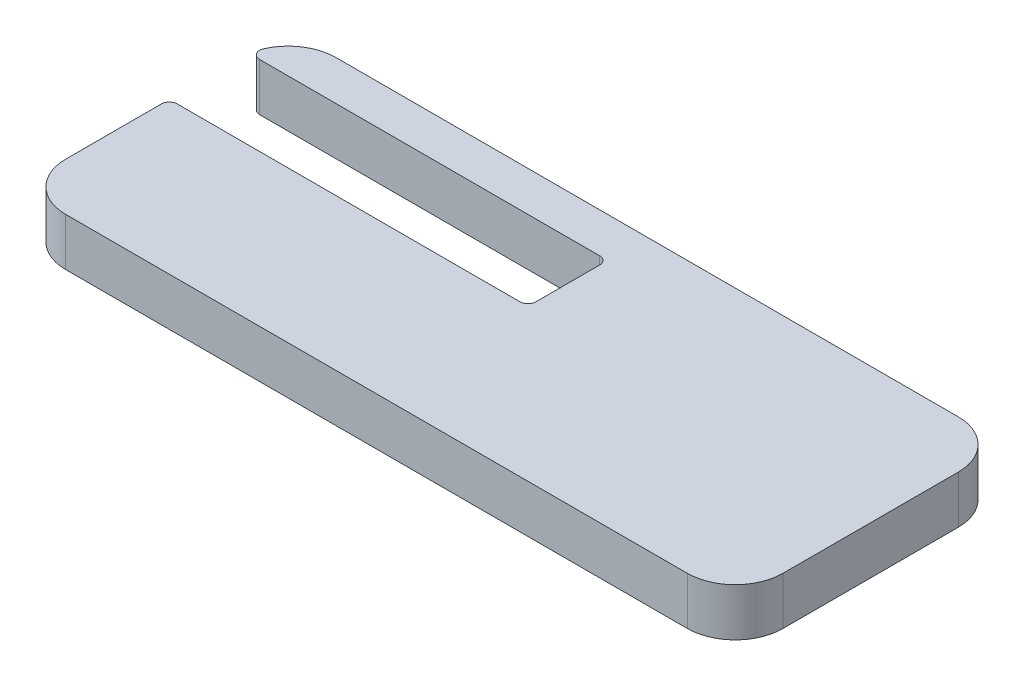
ISO-10303-21;
HEADER;
FILE_DESCRIPTION(('STEP AP214'),'2;1');
FILE_NAME('part.step','',(''),(''),'','','');
FILE_SCHEMA(('AUTOMOTIVE_DESIGN { 1 0 10303 214 1 1 1 1 }'));
ENDSEC;
DATA;
#1=APPLICATION_CONTEXT('core data for automotive mechanical design processes');
#2=APPLICATION_PROTOCOL_DEFINITION('international standard','automotive_design',2000,#1);
#3=PRODUCT_CONTEXT('',#1,'mechanical');
#4=PRODUCT('Part','Part','',(#3));
#5=PRODUCT_RELATED_PRODUCT_CATEGORY('part','',(#4));
#6=PRODUCT_DEFINITION_FORMATION('','',#4);
#7=PRODUCT_DEFINITION_CONTEXT('part definition',#1,'design');
#8=PRODUCT_DEFINITION('design','',#6,#7);
#9=PRODUCT_DEFINITION_SHAPE('','',#8);
#10=(LENGTH_UNIT() NAMED_UNIT(*) SI_UNIT(.MILLI.,.METRE.));
#11=(NAMED_UNIT(*) PLANE_ANGLE_UNIT() SI_UNIT($,.RADIAN.));
#12=(NAMED_UNIT(*) SI_UNIT($,.STERADIAN.) SOLID_ANGLE_UNIT());
#13=UNCERTAINTY_MEASURE_WITH_UNIT(LENGTH_MEASURE(1.E-05),#10,'distance_accuracy_value','');
#14=(GEOMETRIC_REPRESENTATION_CONTEXT(3) GLOBAL_UNCERTAINTY_ASSIGNED_CONTEXT((#13)) GLOBAL_UNIT_ASSIGNED_CONTEXT((#10,
#11,#12)) REPRESENTATION_CONTEXT('',''));
#15=CARTESIAN_POINT('',(0.,0.,0.));
#16=DIRECTION('',(0.,0.,1.));
#17=DIRECTION('',(1.,0.,0.));
#18=AXIS2_PLACEMENT_3D('',#15,#16,#17);
#19=CARTESIAN_POINT('',(-22.5,3.,-9.92984720943611));
#20=DIRECTION('',(1.,0.,0.));
#21=DIRECTION('',(0.,0.,-1.));
#22=AXIS2_PLACEMENT_3D('',#19,#20,#21);
#23=PLANE('',#22);
#24=DIRECTION('',(0.,0.,1.));
#25=VECTOR('',#24,1.);
#26=CARTESIAN_POINT('',(-22.5,3.,-9.92984720943611));
#27=LINE('',#26,#25);
#28=CARTESIAN_POINT('',(-22.5,3.,-1.92984720943611));
#29=VERTEX_POINT('',#28);
#30=CARTESIAN_POINT('',(-22.5,3.,4.07015279056389));
#31=VERTEX_POINT('',#30);
#32=EDGE_CURVE('E196',#29,#31,#27,.T.);
#33=ORIENTED_EDGE('',*,*,#32,.F.);
#34=DIRECTION('',(0.,1.,0.));
#35=VECTOR('',#34,1.);
#36=CARTESIAN_POINT('',(-22.5,3.,-1.92984720943611));
#37=LINE('',#36,#35);
#38=CARTESIAN_POINT('',(-22.5,0.,-1.92984720943611));
#39=VERTEX_POINT('',#38);
#40=EDGE_CURVE('E265',#29,#39,#37,.F.);
#41=ORIENTED_EDGE('',*,*,#40,.T.);
#42=DIRECTION('',(0.,0.,1.));
#43=VECTOR('',#42,1.);
#44=CARTESIAN_POINT('',(-22.5,0.,-9.92984720943611));
#45=LINE('',#44,#43);
#46=CARTESIAN_POINT('',(-22.5,0.,4.07015279056389));
#47=VERTEX_POINT('',#46);
#48=EDGE_CURVE('E182',#39,#47,#45,.T.);
#49=ORIENTED_EDGE('',*,*,#48,.T.);
#50=DIRECTION('',(0.,-1.,0.));
#51=VECTOR('',#50,1.);
#52=CARTESIAN_POINT('',(-22.5,3.,4.07015279056389));
#53=LINE('',#52,#51);
#54=EDGE_CURVE('E158',#47,#31,#53,.F.);
#55=ORIENTED_EDGE('',*,*,#54,.T.);
#56=EDGE_LOOP('',(#33,#41,#49,#55));
#57=FACE_BOUND('',#56,.T.);
#58=ADVANCED_FACE('F42',(#57),#23,.F.);
#59=CARTESIAN_POINT('',(-22.5,3.,7.07015279056389));
#60=DIRECTION('',(0.,0.,-1.));
#61=DIRECTION('',(-1.,0.,0.));
#62=AXIS2_PLACEMENT_3D('',#59,#60,#61);
#63=PLANE('',#62);
#64=DIRECTION('',(1.,0.,0.));
#65=VECTOR('',#64,1.);
#66=CARTESIAN_POINT('',(-22.5,3.,7.07015279056389));
#67=LINE('',#66,#65);
#68=CARTESIAN_POINT('',(-19.5,3.,7.07015279056389));
#69=VERTEX_POINT('',#68);
#70=CARTESIAN_POINT('',(19.5,3.,7.07015279056389));
#71=VERTEX_POINT('',#70);
#72=EDGE_CURVE('E171',#69,#71,#67,.T.);
#73=ORIENTED_EDGE('',*,*,#72,.F.);
#74=DIRECTION('',(0.,-1.,0.));
#75=VECTOR('',#74,1.);
#76=CARTESIAN_POINT('',(-19.5,3.,7.07015279056389));
#77=LINE('',#76,#75);
#78=CARTESIAN_POINT('',(-19.5,0.,7.07015279056389));
#79=VERTEX_POINT('',#78);
#80=EDGE_CURVE('E156',#69,#79,#77,.T.);
#81=ORIENTED_EDGE('',*,*,#80,.T.);
#82=DIRECTION('',(1.,0.,0.));
#83=VECTOR('',#82,1.);
#84=CARTESIAN_POINT('',(-22.5,0.,7.07015279056389));
#85=LINE('',#84,#83);
#86=CARTESIAN_POINT('',(19.5,0.,7.07015279056389));
#87=VERTEX_POINT('',#86);
#88=EDGE_CURVE('E168',#79,#87,#85,.T.);
#89=ORIENTED_EDGE('',*,*,#88,.T.);
#90=DIRECTION('',(0.,-1.,0.));
#91=VECTOR('',#90,1.);
#92=CARTESIAN_POINT('',(19.5,3.,7.07015279056389));
#93=LINE('',#92,#91);
#94=EDGE_CURVE('E174',#87,#71,#93,.F.);
#95=ORIENTED_EDGE('',*,*,#94,.T.);
#96=EDGE_LOOP('',(#73,#81,#89,#95));
#97=FACE_BOUND('',#96,.T.);
#98=ADVANCED_FACE('F167',(#97),#63,.F.);
#99=CARTESIAN_POINT('',(22.5,3.,-9.92984720943611));
#100=DIRECTION('',(-1.,0.,0.));
#101=DIRECTION('',(0.,0.,1.));
#102=AXIS2_PLACEMENT_3D('',#99,#100,#101);
#103=PLANE('',#102);
#104=DIRECTION('',(0.,0.,-1.));
#105=VECTOR('',#104,1.);
#106=CARTESIAN_POINT('',(22.5,3.,-9.92984720943611));
#107=LINE('',#106,#105);
#108=CARTESIAN_POINT('',(22.5,3.,4.07015279056389));
#109=VERTEX_POINT('',#108);
#110=CARTESIAN_POINT('',(22.5,3.,-6.92984720943611));
#111=VERTEX_POINT('',#110);
#112=EDGE_CURVE('E318',#109,#111,#107,.T.);
#113=ORIENTED_EDGE('',*,*,#112,.F.);
#114=DIRECTION('',(0.,-1.,0.));
#115=VECTOR('',#114,1.);
#116=CARTESIAN_POINT('',(22.5,3.,4.07015279056389));
#117=LINE('',#116,#115);
#118=CARTESIAN_POINT('',(22.5,0.,4.07015279056389));
#119=VERTEX_POINT('',#118);
#120=EDGE_CURVE('E231',#109,#119,#117,.T.);
#121=ORIENTED_EDGE('',*,*,#120,.T.);
#122=DIRECTION('',(0.,0.,-1.));
#123=VECTOR('',#122,1.);
#124=CARTESIAN_POINT('',(22.5,0.,-9.92984720943611));
#125=LINE('',#124,#123);
#126=CARTESIAN_POINT('',(22.5,0.,-6.92984720943611));
#127=VERTEX_POINT('',#126);
#128=EDGE_CURVE('E181',#119,#127,#125,.T.);
#129=ORIENTED_EDGE('',*,*,#128,.T.);
#130=DIRECTION('',(0.,-1.,0.));
#131=VECTOR('',#130,1.);
#132=CARTESIAN_POINT('',(22.5,3.,-6.92984720943611));
#133=LINE('',#132,#131);
#134=EDGE_CURVE('E228',#127,#111,#133,.F.);
#135=ORIENTED_EDGE('',*,*,#134,.T.);
#136=EDGE_LOOP('',(#113,#121,#129,#135));
#137=FACE_BOUND('',#136,.T.);
#138=ADVANCED_FACE('F342',(#137),#103,.F.);
#139=CARTESIAN_POINT('',(-22.5,3.,-9.92984720943611));
#140=DIRECTION('',(0.,0.,1.));
#141=DIRECTION('',(1.,0.,0.));
#142=AXIS2_PLACEMENT_3D('',#139,#140,#141);
#143=PLANE('',#142);
#144=DIRECTION('',(-1.,0.,0.));
#145=VECTOR('',#144,1.);
#146=CARTESIAN_POINT('',(-22.5,0.,-9.92984720943611));
#147=LINE('',#146,#145);
#148=CARTESIAN_POINT('',(19.5,0.,-9.92984720943611));
#149=VERTEX_POINT('',#148);
#150=CARTESIAN_POINT('',(-19.5419601084502,0.,-9.92984720943611));
#151=VERTEX_POINT('',#150);
#152=EDGE_CURVE('E187',#149,#151,#147,.T.);
#153=ORIENTED_EDGE('',*,*,#152,.T.);
#154=DIRECTION('',(0.,1.,0.));
#155=VECTOR('',#154,1.);
#156=CARTESIAN_POINT('',(-19.5419601084502,3.,-9.92984720943611));
#157=LINE('',#156,#155);
#158=CARTESIAN_POINT('',(-19.5419601084502,3.,-9.92984720943611));
#159=VERTEX_POINT('',#158);
#160=EDGE_CURVE('E225',#151,#159,#157,.T.);
#161=ORIENTED_EDGE('',*,*,#160,.T.);
#162=DIRECTION('',(-1.,0.,0.));
#163=VECTOR('',#162,1.);
#164=CARTESIAN_POINT('',(-22.5,3.,-9.92984720943611));
#165=LINE('',#164,#163);
#166=CARTESIAN_POINT('',(19.5,3.,-9.92984720943611));
#167=VERTEX_POINT('',#166);
#168=EDGE_CURVE('E198',#167,#159,#165,.T.);
#169=ORIENTED_EDGE('',*,*,#168,.F.);
#170=DIRECTION('',(0.,-1.,0.));
#171=VECTOR('',#170,1.);
#172=CARTESIAN_POINT('',(19.5,3.,-9.92984720943611));
#173=LINE('',#172,#171);
#174=EDGE_CURVE('E221',#167,#149,#173,.T.);
#175=ORIENTED_EDGE('',*,*,#174,.T.);
#176=EDGE_LOOP('',(#153,#161,#169,#175));
#177=FACE_BOUND('',#176,.T.);
#178=ADVANCED_FACE('F336',(#177),#143,.F.);
#179=CARTESIAN_POINT('',(0.,3.,0.));
#180=DIRECTION('',(0.,1.,0.));
#181=DIRECTION('',(0.,0.,1.));
#182=AXIS2_PLACEMENT_3D('',#179,#180,#181);
#183=PLANE('',#182);
#184=CARTESIAN_POINT('',(-19.5419601084502,3.,-6.92984720943611));
#185=DIRECTION('',(0.,1.,0.));
#186=DIRECTION('',(0.,0.,1.));
#187=AXIS2_PLACEMENT_3D('',#184,#185,#186);
#188=CIRCLE('',#187,3.);
#189=CARTESIAN_POINT('',(-22.2915055254237,3.,-8.12984720943611));
#190=VERTEX_POINT('',#189);
#191=EDGE_CURVE('E214',#159,#190,#188,.T.);
#192=ORIENTED_EDGE('',*,*,#191,.T.);
#193=CARTESIAN_POINT('',(-21.8332479559281,3.,-7.92984720943611));
#194=DIRECTION('',(0.,1.,0.));
#195=DIRECTION('',(0.,0.,1.));
#196=AXIS2_PLACEMENT_3D('',#193,#194,#195);
#197=CIRCLE('',#196,0.5);
#198=CARTESIAN_POINT('',(-21.8332479559281,3.,-7.42984720943611));
#199=VERTEX_POINT('',#198);
#200=EDGE_CURVE('E242',#190,#199,#197,.T.);
#201=ORIENTED_EDGE('',*,*,#200,.T.);
#202=DIRECTION('',(-1.,0.,0.));
#203=VECTOR('',#202,1.);
#204=CARTESIAN_POINT('',(-22.5,3.,-7.42984720943611));
#205=LINE('',#204,#203);
#206=CARTESIAN_POINT('',(-0.500000000000007,3.,-7.42984720943611));
#207=VERTEX_POINT('',#206);
#208=EDGE_CURVE('E285',#207,#199,#205,.T.);
#209=ORIENTED_EDGE('',*,*,#208,.F.);
#210=CARTESIAN_POINT('',(-0.5,3.,-6.92984720943611));
#211=DIRECTION('',(0.,1.,0.));
#212=DIRECTION('',(0.,0.,1.));
#213=AXIS2_PLACEMENT_3D('',#210,#211,#212);
#214=CIRCLE('',#213,0.5);
#215=CARTESIAN_POINT('',(0.,3.,-6.92984720943611));
#216=VERTEX_POINT('',#215);
#217=EDGE_CURVE('E51',#207,#216,#214,.F.);
#218=ORIENTED_EDGE('',*,*,#217,.T.);
#219=DIRECTION('',(0.,0.,-1.));
#220=VECTOR('',#219,1.);
#221=CARTESIAN_POINT('',(0.,3.,-7.42984720943611));
#222=LINE('',#221,#220);
#223=CARTESIAN_POINT('',(0.,3.,-2.92984720943611));
#224=VERTEX_POINT('',#223);
#225=EDGE_CURVE('E283',#224,#216,#222,.T.);
#226=ORIENTED_EDGE('',*,*,#225,.F.);
#227=CARTESIAN_POINT('',(-0.499999999999999,3.,-2.92984720943611));
#228=DIRECTION('',(0.,1.,0.));
#229=DIRECTION('',(0.,0.,1.));
#230=AXIS2_PLACEMENT_3D('',#227,#228,#229);
#231=CIRCLE('',#230,0.5);
#232=CARTESIAN_POINT('',(-0.500000000000007,3.,-2.42984720943611));
#233=VERTEX_POINT('',#232);
#234=EDGE_CURVE('E274',#224,#233,#231,.F.);
#235=ORIENTED_EDGE('',*,*,#234,.T.);
#236=DIRECTION('',(1.,0.,0.));
#237=VECTOR('',#236,1.);
#238=CARTESIAN_POINT('',(-22.5,3.,-2.42984720943611));
#239=LINE('',#238,#237);
#240=CARTESIAN_POINT('',(-22.,3.,-2.42984720943611));
#241=VERTEX_POINT('',#240);
#242=EDGE_CURVE('E291',#241,#233,#239,.T.);
#243=ORIENTED_EDGE('',*,*,#242,.F.);
#244=CARTESIAN_POINT('',(-22.,3.,-1.92984720943611));
#245=DIRECTION('',(0.,1.,0.));
#246=DIRECTION('',(0.,0.,1.));
#247=AXIS2_PLACEMENT_3D('',#244,#245,#246);
#248=CIRCLE('',#247,0.5);
#249=EDGE_CURVE('E239',#241,#29,#248,.T.);
#250=ORIENTED_EDGE('',*,*,#249,.T.);
#251=ORIENTED_EDGE('',*,*,#32,.T.);
#252=CARTESIAN_POINT('',(-19.5,3.,4.07015279056389));
#253=DIRECTION('',(0.,1.,0.));
#254=DIRECTION('',(0.,0.,1.));
#255=AXIS2_PLACEMENT_3D('',#252,#253,#254);
#256=CIRCLE('',#255,3.);
#257=EDGE_CURVE('E218',#31,#69,#256,.T.);
#258=ORIENTED_EDGE('',*,*,#257,.T.);
#259=ORIENTED_EDGE('',*,*,#72,.T.);
#260=CARTESIAN_POINT('',(19.5,3.,4.07015279056389));
#261=DIRECTION('',(0.,1.,0.));
#262=DIRECTION('',(0.,0.,1.));
#263=AXIS2_PLACEMENT_3D('',#260,#261,#262);
#264=CIRCLE('',#263,3.);
#265=EDGE_CURVE('E211',#71,#109,#264,.T.);
#266=ORIENTED_EDGE('',*,*,#265,.T.);
#267=ORIENTED_EDGE('',*,*,#112,.T.);
#268=CARTESIAN_POINT('',(19.5,3.,-6.92984720943611));
#269=DIRECTION('',(0.,1.,0.));
#270=DIRECTION('',(0.,0.,1.));
#271=AXIS2_PLACEMENT_3D('',#268,#269,#270);
#272=CIRCLE('',#271,3.);
#273=EDGE_CURVE('E208',#111,#167,#272,.T.);
#274=ORIENTED_EDGE('',*,*,#273,.T.);
#275=ORIENTED_EDGE('',*,*,#168,.T.);
#276=EDGE_LOOP('',(#192,#201,#209,#218,#226,#235,#243,#250,#251,#258,#259,#266,#267,#274,#275));
#277=FACE_BOUND('',#276,.T.);
#278=ADVANCED_FACE('F282',(#277),#183,.T.);
#279=CARTESIAN_POINT('',(0.,0.,0.));
#280=DIRECTION('',(0.,1.,0.));
#281=DIRECTION('',(0.,0.,1.));
#282=AXIS2_PLACEMENT_3D('',#279,#280,#281);
#283=PLANE('',#282);
#284=DIRECTION('',(1.,0.,0.));
#285=VECTOR('',#284,1.);
#286=CARTESIAN_POINT('',(-22.5,0.,-7.42984720943611));
#287=LINE('',#286,#285);
#288=CARTESIAN_POINT('',(-21.8332479559281,0.,-7.42984720943611));
#289=VERTEX_POINT('',#288);
#290=CARTESIAN_POINT('',(-0.5,0.,-7.42984720943611));
#291=VERTEX_POINT('',#290);
#292=EDGE_CURVE('E295',#289,#291,#287,.T.);
#293=ORIENTED_EDGE('',*,*,#292,.F.);
#294=CARTESIAN_POINT('',(-21.8332479559281,0.,-7.92984720943611));
#295=DIRECTION('',(0.,1.,0.));
#296=DIRECTION('',(0.,0.,1.));
#297=AXIS2_PLACEMENT_3D('',#294,#295,#296);
#298=CIRCLE('',#297,0.5);
#299=CARTESIAN_POINT('',(-22.2915055254237,0.,-8.12984720943611));
#300=VERTEX_POINT('',#299);
#301=EDGE_CURVE('E255',#289,#300,#298,.F.);
#302=ORIENTED_EDGE('',*,*,#301,.T.);
#303=CARTESIAN_POINT('',(-19.5419601084502,0.,-6.92984720943611));
#304=DIRECTION('',(0.,1.,0.));
#305=DIRECTION('',(0.,0.,1.));
#306=AXIS2_PLACEMENT_3D('',#303,#304,#305);
#307=CIRCLE('',#306,3.);
#308=EDGE_CURVE('E162',#300,#151,#307,.F.);
#309=ORIENTED_EDGE('',*,*,#308,.T.);
#310=ORIENTED_EDGE('',*,*,#152,.F.);
#311=CARTESIAN_POINT('',(19.5,0.,-6.92984720943611));
#312=DIRECTION('',(0.,1.,0.));
#313=DIRECTION('',(0.,0.,1.));
#314=AXIS2_PLACEMENT_3D('',#311,#312,#313);
#315=CIRCLE('',#314,3.);
#316=EDGE_CURVE('E173',#149,#127,#315,.F.);
#317=ORIENTED_EDGE('',*,*,#316,.T.);
#318=ORIENTED_EDGE('',*,*,#128,.F.);
#319=CARTESIAN_POINT('',(19.5,0.,4.07015279056389));
#320=DIRECTION('',(0.,1.,0.));
#321=DIRECTION('',(0.,0.,1.));
#322=AXIS2_PLACEMENT_3D('',#319,#320,#321);
#323=CIRCLE('',#322,3.);
#324=EDGE_CURVE('E179',#119,#87,#323,.F.);
#325=ORIENTED_EDGE('',*,*,#324,.T.);
#326=ORIENTED_EDGE('',*,*,#88,.F.);
#327=CARTESIAN_POINT('',(-19.5,0.,4.07015279056389));
#328=DIRECTION('',(0.,1.,0.));
#329=DIRECTION('',(0.,0.,1.));
#330=AXIS2_PLACEMENT_3D('',#327,#328,#329);
#331=CIRCLE('',#330,3.);
#332=EDGE_CURVE('E152',#79,#47,#331,.F.);
#333=ORIENTED_EDGE('',*,*,#332,.T.);
#334=ORIENTED_EDGE('',*,*,#48,.F.);
#335=CARTESIAN_POINT('',(-22.,0.,-1.92984720943611));
#336=DIRECTION('',(0.,1.,0.));
#337=DIRECTION('',(0.,0.,1.));
#338=AXIS2_PLACEMENT_3D('',#335,#336,#337);
#339=CIRCLE('',#338,0.5);
#340=CARTESIAN_POINT('',(-22.,0.,-2.42984720943611));
#341=VERTEX_POINT('',#340);
#342=EDGE_CURVE('E252',#39,#341,#339,.F.);
#343=ORIENTED_EDGE('',*,*,#342,.T.);
#344=DIRECTION('',(-1.,0.,0.));
#345=VECTOR('',#344,1.);
#346=CARTESIAN_POINT('',(-22.5,0.,-2.42984720943611));
#347=LINE('',#346,#345);
#348=CARTESIAN_POINT('',(-0.5,0.,-2.42984720943611));
#349=VERTEX_POINT('',#348);
#350=EDGE_CURVE('E189',#349,#341,#347,.T.);
#351=ORIENTED_EDGE('',*,*,#350,.F.);
#352=CARTESIAN_POINT('',(-0.499999999999999,0.,-2.92984720943611));
#353=DIRECTION('',(0.,1.,0.));
#354=DIRECTION('',(0.,0.,1.));
#355=AXIS2_PLACEMENT_3D('',#352,#353,#354);
#356=CIRCLE('',#355,0.5);
#357=CARTESIAN_POINT('',(0.,0.,-2.92984720943611));
#358=VERTEX_POINT('',#357);
#359=EDGE_CURVE('E58',#349,#358,#356,.T.);
#360=ORIENTED_EDGE('',*,*,#359,.T.);
#361=DIRECTION('',(0.,0.,1.));
#362=VECTOR('',#361,1.);
#363=CARTESIAN_POINT('',(0.,0.,-7.42984720943611));
#364=LINE('',#363,#362);
#365=CARTESIAN_POINT('',(0.,0.,-6.92984720943611));
#366=VERTEX_POINT('',#365);
#367=EDGE_CURVE('E297',#366,#358,#364,.T.);
#368=ORIENTED_EDGE('',*,*,#367,.F.);
#369=CARTESIAN_POINT('',(-0.5,0.,-6.92984720943611));
#370=DIRECTION('',(0.,1.,0.));
#371=DIRECTION('',(0.,0.,1.));
#372=AXIS2_PLACEMENT_3D('',#369,#370,#371);
#373=CIRCLE('',#372,0.5);
#374=EDGE_CURVE('E11',#366,#291,#373,.T.);
#375=ORIENTED_EDGE('',*,*,#374,.T.);
#376=EDGE_LOOP('',(#293,#302,#309,#310,#317,#318,#325,#326,#333,#334,#343,#351,#360,#368,#375));
#377=FACE_BOUND('',#376,.T.);
#378=ADVANCED_FACE('F177',(#377),#283,.F.);
#379=CARTESIAN_POINT('',(-22.5,-23.0488611432322,-7.42984720943611));
#380=DIRECTION('',(0.,0.,-1.));
#381=DIRECTION('',(-1.,0.,0.));
#382=AXIS2_PLACEMENT_3D('',#379,#380,#381);
#383=PLANE('',#382);
#384=ORIENTED_EDGE('',*,*,#208,.T.);
#385=DIRECTION('',(0.,-1.,0.));
#386=VECTOR('',#385,1.);
#387=CARTESIAN_POINT('',(-21.8332479559281,0.,-7.42984720943611));
#388=LINE('',#387,#386);
#389=EDGE_CURVE('E249',#199,#289,#388,.T.);
#390=ORIENTED_EDGE('',*,*,#389,.T.);
#391=ORIENTED_EDGE('',*,*,#292,.T.);
#392=DIRECTION('',(0.,1.,0.));
#393=VECTOR('',#392,1.);
#394=CARTESIAN_POINT('',(-0.5,3.,-7.42984720943611));
#395=LINE('',#394,#393);
#396=EDGE_CURVE('E245',#291,#207,#395,.T.);
#397=ORIENTED_EDGE('',*,*,#396,.T.);
#398=EDGE_LOOP('',(#384,#390,#391,#397));
#399=FACE_BOUND('',#398,.T.);
#400=ADVANCED_FACE('F299',(#399),#383,.F.);
#401=CARTESIAN_POINT('',(0.,-23.0488611432322,-7.42984720943611));
#402=DIRECTION('',(1.,0.,0.));
#403=DIRECTION('',(0.,0.,-1.));
#404=AXIS2_PLACEMENT_3D('',#401,#402,#403);
#405=PLANE('',#404);
#406=ORIENTED_EDGE('',*,*,#367,.T.);
#407=DIRECTION('',(0.,1.,0.));
#408=VECTOR('',#407,1.);
#409=CARTESIAN_POINT('',(0.,3.,-2.92984720943611));
#410=LINE('',#409,#408);
#411=EDGE_CURVE('E270',#358,#224,#410,.T.);
#412=ORIENTED_EDGE('',*,*,#411,.T.);
#413=ORIENTED_EDGE('',*,*,#225,.T.);
#414=DIRECTION('',(0.,1.,0.));
#415=VECTOR('',#414,1.);
#416=CARTESIAN_POINT('',(0.,0.,-6.92984720943611));
#417=LINE('',#416,#415);
#418=EDGE_CURVE('E65',#216,#366,#417,.F.);
#419=ORIENTED_EDGE('',*,*,#418,.T.);
#420=EDGE_LOOP('',(#406,#412,#413,#419));
#421=FACE_BOUND('',#420,.T.);
#422=ADVANCED_FACE('F288',(#421),#405,.F.);
#423=CARTESIAN_POINT('',(-22.5,-23.0488611432322,-2.42984720943611));
#424=DIRECTION('',(0.,0.,1.));
#425=DIRECTION('',(1.,0.,0.));
#426=AXIS2_PLACEMENT_3D('',#423,#424,#425);
#427=PLANE('',#426);
#428=ORIENTED_EDGE('',*,*,#350,.T.);
#429=DIRECTION('',(0.,1.,0.));
#430=VECTOR('',#429,1.);
#431=CARTESIAN_POINT('',(-22.,-23.0488611432322,-2.42984720943611));
#432=LINE('',#431,#430);
#433=EDGE_CURVE('E261',#341,#241,#432,.T.);
#434=ORIENTED_EDGE('',*,*,#433,.T.);
#435=ORIENTED_EDGE('',*,*,#242,.T.);
#436=DIRECTION('',(0.,1.,0.));
#437=VECTOR('',#436,1.);
#438=CARTESIAN_POINT('',(-0.499999999999999,0.,-2.42984720943611));
#439=LINE('',#438,#437);
#440=EDGE_CURVE('E258',#233,#349,#439,.F.);
#441=ORIENTED_EDGE('',*,*,#440,.T.);
#442=EDGE_LOOP('',(#428,#434,#435,#441));
#443=FACE_BOUND('',#442,.T.);
#444=ADVANCED_FACE('F356',(#443),#427,.F.);
#445=CARTESIAN_POINT('',(-19.5,3.,4.07015279056389));
#446=DIRECTION('',(0.,-1.,0.));
#447=DIRECTION('',(0.,0.,-1.));
#448=AXIS2_PLACEMENT_3D('',#445,#446,#447);
#449=CYLINDRICAL_SURFACE('',#448,3.);
#450=ORIENTED_EDGE('',*,*,#257,.F.);
#451=ORIENTED_EDGE('',*,*,#54,.F.);
#452=ORIENTED_EDGE('',*,*,#332,.F.);
#453=ORIENTED_EDGE('',*,*,#80,.F.);
#454=EDGE_LOOP('',(#450,#451,#452,#453));
#455=FACE_BOUND('',#454,.T.);
#456=ADVANCED_FACE('F155',(#455),#449,.T.);
#457=CARTESIAN_POINT('',(-19.5419601084502,3.,-6.92984720943611));
#458=DIRECTION('',(0.,1.,0.));
#459=DIRECTION('',(0.,0.,1.));
#460=AXIS2_PLACEMENT_3D('',#457,#458,#459);
#461=CYLINDRICAL_SURFACE('',#460,3.);
#462=ORIENTED_EDGE('',*,*,#308,.F.);
#463=DIRECTION('',(0.,1.,0.));
#464=VECTOR('',#463,1.);
#465=CARTESIAN_POINT('',(-22.2915055254237,3.,-8.12984720943611));
#466=LINE('',#465,#464);
#467=EDGE_CURVE('E235',#300,#190,#466,.T.);
#468=ORIENTED_EDGE('',*,*,#467,.T.);
#469=ORIENTED_EDGE('',*,*,#191,.F.);
#470=ORIENTED_EDGE('',*,*,#160,.F.);
#471=EDGE_LOOP('',(#462,#468,#469,#470));
#472=FACE_BOUND('',#471,.T.);
#473=ADVANCED_FACE('F331',(#472),#461,.T.);
#474=CARTESIAN_POINT('',(19.5,3.,4.07015279056389));
#475=DIRECTION('',(0.,-1.,0.));
#476=DIRECTION('',(0.,0.,-1.));
#477=AXIS2_PLACEMENT_3D('',#474,#475,#476);
#478=CYLINDRICAL_SURFACE('',#477,3.);
#479=ORIENTED_EDGE('',*,*,#265,.F.);
#480=ORIENTED_EDGE('',*,*,#94,.F.);
#481=ORIENTED_EDGE('',*,*,#324,.F.);
#482=ORIENTED_EDGE('',*,*,#120,.F.);
#483=EDGE_LOOP('',(#479,#480,#481,#482));
#484=FACE_BOUND('',#483,.T.);
#485=ADVANCED_FACE('F346',(#484),#478,.T.);
#486=CARTESIAN_POINT('',(19.5,3.,-6.92984720943611));
#487=DIRECTION('',(0.,-1.,0.));
#488=DIRECTION('',(0.,0.,-1.));
#489=AXIS2_PLACEMENT_3D('',#486,#487,#488);
#490=CYLINDRICAL_SURFACE('',#489,3.);
#491=ORIENTED_EDGE('',*,*,#273,.F.);
#492=ORIENTED_EDGE('',*,*,#134,.F.);
#493=ORIENTED_EDGE('',*,*,#316,.F.);
#494=ORIENTED_EDGE('',*,*,#174,.F.);
#495=EDGE_LOOP('',(#491,#492,#493,#494));
#496=FACE_BOUND('',#495,.T.);
#497=ADVANCED_FACE('F338',(#496),#490,.T.);
#498=CARTESIAN_POINT('',(-21.8332479559281,3.,-7.92984720943611));
#499=DIRECTION('',(0.,1.,0.));
#500=DIRECTION('',(0.,0.,1.));
#501=AXIS2_PLACEMENT_3D('',#498,#499,#500);
#502=CYLINDRICAL_SURFACE('',#501,0.5);
#503=ORIENTED_EDGE('',*,*,#301,.F.);
#504=ORIENTED_EDGE('',*,*,#389,.F.);
#505=ORIENTED_EDGE('',*,*,#200,.F.);
#506=ORIENTED_EDGE('',*,*,#467,.F.);
#507=EDGE_LOOP('',(#503,#504,#505,#506));
#508=FACE_BOUND('',#507,.T.);
#509=ADVANCED_FACE('F334',(#508),#502,.T.);
#510=CARTESIAN_POINT('',(-22.,-23.0488611432322,-1.92984720943611));
#511=DIRECTION('',(0.,1.,0.));
#512=DIRECTION('',(0.,0.,1.));
#513=AXIS2_PLACEMENT_3D('',#510,#511,#512);
#514=CYLINDRICAL_SURFACE('',#513,0.5);
#515=ORIENTED_EDGE('',*,*,#342,.F.);
#516=ORIENTED_EDGE('',*,*,#40,.F.);
#517=ORIENTED_EDGE('',*,*,#249,.F.);
#518=ORIENTED_EDGE('',*,*,#433,.F.);
#519=EDGE_LOOP('',(#515,#516,#517,#518));
#520=FACE_BOUND('',#519,.T.);
#521=ADVANCED_FACE('F354',(#520),#514,.T.);
#522=CARTESIAN_POINT('',(-0.499999999999999,-23.0488611432322,-2.92984720943611));
#523=DIRECTION('',(0.,-1.,0.));
#524=DIRECTION('',(0.,0.,-1.));
#525=AXIS2_PLACEMENT_3D('',#522,#523,#524);
#526=CYLINDRICAL_SURFACE('',#525,0.5);
#527=ORIENTED_EDGE('',*,*,#359,.F.);
#528=ORIENTED_EDGE('',*,*,#440,.F.);
#529=ORIENTED_EDGE('',*,*,#234,.F.);
#530=ORIENTED_EDGE('',*,*,#411,.F.);
#531=EDGE_LOOP('',(#527,#528,#529,#530));
#532=FACE_BOUND('',#531,.T.);
#533=ADVANCED_FACE('F359',(#532),#526,.F.);
#534=CARTESIAN_POINT('',(-0.5,-23.0488611432322,-6.92984720943611));
#535=DIRECTION('',(0.,-1.,0.));
#536=DIRECTION('',(0.,0.,-1.));
#537=AXIS2_PLACEMENT_3D('',#534,#535,#536);
#538=CYLINDRICAL_SURFACE('',#537,0.5);
#539=ORIENTED_EDGE('',*,*,#374,.F.);
#540=ORIENTED_EDGE('',*,*,#418,.F.);
#541=ORIENTED_EDGE('',*,*,#217,.F.);
#542=ORIENTED_EDGE('',*,*,#396,.F.);
#543=EDGE_LOOP('',(#539,#540,#541,#542));
#544=FACE_BOUND('',#543,.T.);
#545=ADVANCED_FACE('F44',(#544),#538,.F.);
#546=CLOSED_SHELL('',(#58,#98,#138,#178,#278,#378,#400,#422,#444,#456,#473,#485,#497,#509,#521,
#533,#545));
#547=MANIFOLD_SOLID_BREP('B2',#546);
#548=ADVANCED_BREP_SHAPE_REPRESENTATION('',(#18,#547),#14);
#549=SHAPE_DEFINITION_REPRESENTATION(#9,#548);
ENDSEC;
END-ISO-10303-21;
